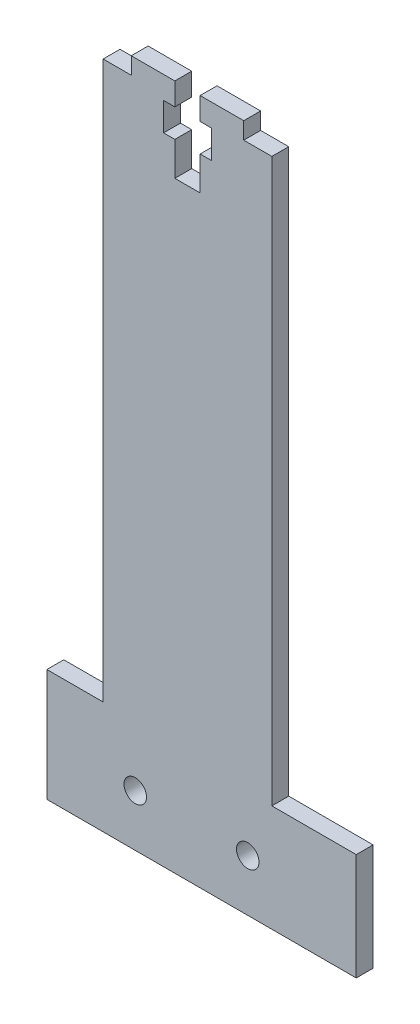
ISO-10303-21;
HEADER;
FILE_DESCRIPTION(('STEP AP214'),'2;1');
FILE_NAME('part.step','',(''),(''),'','','');
FILE_SCHEMA(('AUTOMOTIVE_DESIGN { 1 0 10303 214 1 1 1 1 }'));
ENDSEC;
DATA;
#1=APPLICATION_CONTEXT('core data for automotive mechanical design processes');
#2=APPLICATION_PROTOCOL_DEFINITION('international standard','automotive_design',2000,#1);
#3=PRODUCT_CONTEXT('',#1,'mechanical');
#4=PRODUCT('Part','Part','',(#3));
#5=PRODUCT_RELATED_PRODUCT_CATEGORY('part','',(#4));
#6=PRODUCT_DEFINITION_FORMATION('','',#4);
#7=PRODUCT_DEFINITION_CONTEXT('part definition',#1,'design');
#8=PRODUCT_DEFINITION('design','',#6,#7);
#9=PRODUCT_DEFINITION_SHAPE('','',#8);
#10=(LENGTH_UNIT() NAMED_UNIT(*) SI_UNIT(.MILLI.,.METRE.));
#11=(NAMED_UNIT(*) PLANE_ANGLE_UNIT() SI_UNIT($,.RADIAN.));
#12=(NAMED_UNIT(*) SI_UNIT($,.STERADIAN.) SOLID_ANGLE_UNIT());
#13=UNCERTAINTY_MEASURE_WITH_UNIT(LENGTH_MEASURE(1.E-05),#10,'distance_accuracy_value','');
#14=(GEOMETRIC_REPRESENTATION_CONTEXT(3) GLOBAL_UNCERTAINTY_ASSIGNED_CONTEXT((#13)) GLOBAL_UNIT_ASSIGNED_CONTEXT((#10,
#11,#12)) REPRESENTATION_CONTEXT('',''));
#15=CARTESIAN_POINT('',(0.,0.,0.));
#16=DIRECTION('',(0.,0.,1.));
#17=DIRECTION('',(1.,0.,0.));
#18=AXIS2_PLACEMENT_3D('',#15,#16,#17);
#19=CARTESIAN_POINT('',(-25.,0.,3.));
#20=DIRECTION('',(-1.,0.,0.));
#21=DIRECTION('',(0.,0.,1.));
#22=AXIS2_PLACEMENT_3D('',#19,#20,#21);
#23=PLANE('',#22);
#24=DIRECTION('',(0.,1.,0.));
#25=VECTOR('',#24,1.);
#26=CARTESIAN_POINT('',(-25.,0.,0.));
#27=LINE('',#26,#25);
#28=CARTESIAN_POINT('',(-25.,-59.5,0.));
#29=VERTEX_POINT('',#28);
#30=CARTESIAN_POINT('',(-25.,-39.5,0.));
#31=VERTEX_POINT('',#30);
#32=EDGE_CURVE('E255',#29,#31,#27,.T.);
#33=ORIENTED_EDGE('',*,*,#32,.F.);
#34=DIRECTION('',(0.,0.,-1.));
#35=VECTOR('',#34,1.);
#36=CARTESIAN_POINT('',(-25.,-59.5,3.));
#37=LINE('',#36,#35);
#38=CARTESIAN_POINT('',(-25.,-59.5,3.));
#39=VERTEX_POINT('',#38);
#40=EDGE_CURVE('E11',#39,#29,#37,.T.);
#41=ORIENTED_EDGE('',*,*,#40,.F.);
#42=DIRECTION('',(0.,1.,0.));
#43=VECTOR('',#42,1.);
#44=CARTESIAN_POINT('',(-25.,0.,3.));
#45=LINE('',#44,#43);
#46=CARTESIAN_POINT('',(-25.,-39.5,3.));
#47=VERTEX_POINT('',#46);
#48=EDGE_CURVE('E249',#39,#47,#45,.T.);
#49=ORIENTED_EDGE('',*,*,#48,.T.);
#50=DIRECTION('',(0.,0.,-1.));
#51=VECTOR('',#50,1.);
#52=CARTESIAN_POINT('',(-25.,-39.5,3.));
#53=LINE('',#52,#51);
#54=EDGE_CURVE('E139',#47,#31,#53,.T.);
#55=ORIENTED_EDGE('',*,*,#54,.T.);
#56=EDGE_LOOP('',(#33,#41,#49,#55));
#57=FACE_BOUND('',#56,.T.);
#58=ADVANCED_FACE('F41',(#57),#23,.T.);
#59=CARTESIAN_POINT('',(0.,-59.5,3.));
#60=DIRECTION('',(0.,-1.,0.));
#61=DIRECTION('',(0.,0.,-1.));
#62=AXIS2_PLACEMENT_3D('',#59,#60,#61);
#63=PLANE('',#62);
#64=DIRECTION('',(-1.,0.,0.));
#65=VECTOR('',#64,1.);
#66=CARTESIAN_POINT('',(0.,-59.5,0.));
#67=LINE('',#66,#65);
#68=CARTESIAN_POINT('',(30.,-59.5,0.));
#69=VERTEX_POINT('',#68);
#70=EDGE_CURVE('E290',#69,#29,#67,.T.);
#71=ORIENTED_EDGE('',*,*,#70,.F.);
#72=DIRECTION('',(0.,0.,-1.));
#73=VECTOR('',#72,1.);
#74=CARTESIAN_POINT('',(30.,-59.5,3.));
#75=LINE('',#74,#73);
#76=CARTESIAN_POINT('',(30.,-59.5,3.));
#77=VERTEX_POINT('',#76);
#78=EDGE_CURVE('E49',#77,#69,#75,.T.);
#79=ORIENTED_EDGE('',*,*,#78,.F.);
#80=DIRECTION('',(-1.,0.,0.));
#81=VECTOR('',#80,1.);
#82=CARTESIAN_POINT('',(0.,-59.5,3.));
#83=LINE('',#82,#81);
#84=EDGE_CURVE('E246',#77,#39,#83,.T.);
#85=ORIENTED_EDGE('',*,*,#84,.T.);
#86=ORIENTED_EDGE('',*,*,#40,.T.);
#87=EDGE_LOOP('',(#71,#79,#85,#86));
#88=FACE_BOUND('',#87,.T.);
#89=ADVANCED_FACE('F280',(#88),#63,.T.);
#90=CARTESIAN_POINT('',(30.,0.,3.));
#91=DIRECTION('',(-1.,0.,0.));
#92=DIRECTION('',(0.,0.,1.));
#93=AXIS2_PLACEMENT_3D('',#90,#91,#92);
#94=PLANE('',#93);
#95=DIRECTION('',(0.,1.,0.));
#96=VECTOR('',#95,1.);
#97=CARTESIAN_POINT('',(30.,0.,0.));
#98=LINE('',#97,#96);
#99=CARTESIAN_POINT('',(30.,-40.5,0.));
#100=VERTEX_POINT('',#99);
#101=EDGE_CURVE('E296',#69,#100,#98,.T.);
#102=ORIENTED_EDGE('',*,*,#101,.T.);
#103=DIRECTION('',(0.,0.,-1.));
#104=VECTOR('',#103,1.);
#105=CARTESIAN_POINT('',(30.,-40.5,3.));
#106=LINE('',#105,#104);
#107=CARTESIAN_POINT('',(30.,-40.5,3.));
#108=VERTEX_POINT('',#107);
#109=EDGE_CURVE('E393',#108,#100,#106,.T.);
#110=ORIENTED_EDGE('',*,*,#109,.F.);
#111=DIRECTION('',(0.,1.,0.));
#112=VECTOR('',#111,1.);
#113=CARTESIAN_POINT('',(30.,0.,3.));
#114=LINE('',#113,#112);
#115=EDGE_CURVE('E242',#77,#108,#114,.T.);
#116=ORIENTED_EDGE('',*,*,#115,.F.);
#117=ORIENTED_EDGE('',*,*,#78,.T.);
#118=EDGE_LOOP('',(#102,#110,#116,#117));
#119=FACE_BOUND('',#118,.T.);
#120=ADVANCED_FACE('F284',(#119),#94,.F.);
#121=CARTESIAN_POINT('',(0.,-40.5,3.));
#122=DIRECTION('',(0.,1.,0.));
#123=DIRECTION('',(-1.,0.,0.));
#124=AXIS2_PLACEMENT_3D('',#121,#122,#123);
#125=PLANE('',#124);
#126=DIRECTION('',(1.,0.,0.));
#127=VECTOR('',#126,1.);
#128=CARTESIAN_POINT('',(0.,-40.5,0.));
#129=LINE('',#128,#127);
#130=CARTESIAN_POINT('',(15.,-40.5,0.));
#131=VERTEX_POINT('',#130);
#132=EDGE_CURVE('E298',#131,#100,#129,.T.);
#133=ORIENTED_EDGE('',*,*,#132,.F.);
#134=DIRECTION('',(0.,0.,-1.));
#135=VECTOR('',#134,1.);
#136=CARTESIAN_POINT('',(15.,-40.5,3.));
#137=LINE('',#136,#135);
#138=CARTESIAN_POINT('',(15.,-40.5,3.));
#139=VERTEX_POINT('',#138);
#140=EDGE_CURVE('E391',#139,#131,#137,.T.);
#141=ORIENTED_EDGE('',*,*,#140,.F.);
#142=DIRECTION('',(1.,0.,0.));
#143=VECTOR('',#142,1.);
#144=CARTESIAN_POINT('',(0.,-40.5,3.));
#145=LINE('',#144,#143);
#146=EDGE_CURVE('E238',#139,#108,#145,.T.);
#147=ORIENTED_EDGE('',*,*,#146,.T.);
#148=ORIENTED_EDGE('',*,*,#109,.T.);
#149=EDGE_LOOP('',(#133,#141,#147,#148));
#150=FACE_BOUND('',#149,.T.);
#151=ADVANCED_FACE('F401',(#150),#125,.T.);
#152=CARTESIAN_POINT('',(15.,0.,3.));
#153=DIRECTION('',(1.,0.,0.));
#154=DIRECTION('',(0.,1.,0.));
#155=AXIS2_PLACEMENT_3D('',#152,#153,#154);
#156=PLANE('',#155);
#157=DIRECTION('',(0.,-1.,0.));
#158=VECTOR('',#157,1.);
#159=CARTESIAN_POINT('',(15.,0.,0.));
#160=LINE('',#159,#158);
#161=CARTESIAN_POINT('',(15.,59.5,0.));
#162=VERTEX_POINT('',#161);
#163=EDGE_CURVE('E303',#162,#131,#160,.T.);
#164=ORIENTED_EDGE('',*,*,#163,.F.);
#165=DIRECTION('',(0.,0.,-1.));
#166=VECTOR('',#165,1.);
#167=CARTESIAN_POINT('',(15.,59.5,3.));
#168=LINE('',#167,#166);
#169=CARTESIAN_POINT('',(15.,59.5,3.));
#170=VERTEX_POINT('',#169);
#171=EDGE_CURVE('E389',#170,#162,#168,.T.);
#172=ORIENTED_EDGE('',*,*,#171,.F.);
#173=DIRECTION('',(0.,-1.,0.));
#174=VECTOR('',#173,1.);
#175=CARTESIAN_POINT('',(15.,0.,3.));
#176=LINE('',#175,#174);
#177=EDGE_CURVE('E233',#170,#139,#176,.T.);
#178=ORIENTED_EDGE('',*,*,#177,.T.);
#179=ORIENTED_EDGE('',*,*,#140,.T.);
#180=EDGE_LOOP('',(#164,#172,#178,#179));
#181=FACE_BOUND('',#180,.T.);
#182=ADVANCED_FACE('F403',(#181),#156,.T.);
#183=CARTESIAN_POINT('',(0.,59.5,3.));
#184=DIRECTION('',(0.,1.,0.));
#185=DIRECTION('',(0.,0.,1.));
#186=AXIS2_PLACEMENT_3D('',#183,#184,#185);
#187=PLANE('',#186);
#188=DIRECTION('',(1.,0.,0.));
#189=VECTOR('',#188,1.);
#190=CARTESIAN_POINT('',(0.,59.5,0.));
#191=LINE('',#190,#189);
#192=CARTESIAN_POINT('',(9.99999999999999,59.5,0.));
#193=VERTEX_POINT('',#192);
#194=EDGE_CURVE('E306',#193,#162,#191,.T.);
#195=ORIENTED_EDGE('',*,*,#194,.F.);
#196=DIRECTION('',(0.,0.,-1.));
#197=VECTOR('',#196,1.);
#198=CARTESIAN_POINT('',(9.99999999999999,59.5,3.));
#199=LINE('',#198,#197);
#200=CARTESIAN_POINT('',(9.99999999999999,59.5,3.));
#201=VERTEX_POINT('',#200);
#202=EDGE_CURVE('E387',#201,#193,#199,.T.);
#203=ORIENTED_EDGE('',*,*,#202,.F.);
#204=DIRECTION('',(1.,0.,0.));
#205=VECTOR('',#204,1.);
#206=CARTESIAN_POINT('',(0.,59.5,3.));
#207=LINE('',#206,#205);
#208=EDGE_CURVE('E226',#201,#170,#207,.T.);
#209=ORIENTED_EDGE('',*,*,#208,.T.);
#210=ORIENTED_EDGE('',*,*,#171,.T.);
#211=EDGE_LOOP('',(#195,#203,#209,#210));
#212=FACE_BOUND('',#211,.T.);
#213=ADVANCED_FACE('F406',(#212),#187,.T.);
#214=CARTESIAN_POINT('',(9.99999999999999,0.,3.));
#215=DIRECTION('',(-1.,0.,0.));
#216=DIRECTION('',(0.,0.,1.));
#217=AXIS2_PLACEMENT_3D('',#214,#215,#216);
#218=PLANE('',#217);
#219=DIRECTION('',(0.,1.,0.));
#220=VECTOR('',#219,1.);
#221=CARTESIAN_POINT('',(9.99999999999999,0.,0.));
#222=LINE('',#221,#220);
#223=CARTESIAN_POINT('',(9.99999999999999,62.5,0.));
#224=VERTEX_POINT('',#223);
#225=EDGE_CURVE('E309',#193,#224,#222,.T.);
#226=ORIENTED_EDGE('',*,*,#225,.T.);
#227=DIRECTION('',(0.,0.,-1.));
#228=VECTOR('',#227,1.);
#229=CARTESIAN_POINT('',(9.99999999999999,62.5,3.));
#230=LINE('',#229,#228);
#231=CARTESIAN_POINT('',(9.99999999999999,62.5,3.));
#232=VERTEX_POINT('',#231);
#233=EDGE_CURVE('E385',#232,#224,#230,.T.);
#234=ORIENTED_EDGE('',*,*,#233,.F.);
#235=DIRECTION('',(0.,1.,0.));
#236=VECTOR('',#235,1.);
#237=CARTESIAN_POINT('',(9.99999999999999,0.,3.));
#238=LINE('',#237,#236);
#239=EDGE_CURVE('E232',#201,#232,#238,.T.);
#240=ORIENTED_EDGE('',*,*,#239,.F.);
#241=ORIENTED_EDGE('',*,*,#202,.T.);
#242=EDGE_LOOP('',(#226,#234,#240,#241));
#243=FACE_BOUND('',#242,.T.);
#244=ADVANCED_FACE('F410',(#243),#218,.F.);
#245=CARTESIAN_POINT('',(0.,62.5,3.));
#246=DIRECTION('',(0.,1.,0.));
#247=DIRECTION('',(0.,0.,1.));
#248=AXIS2_PLACEMENT_3D('',#245,#246,#247);
#249=PLANE('',#248);
#250=DIRECTION('',(1.,0.,0.));
#251=VECTOR('',#250,1.);
#252=CARTESIAN_POINT('',(0.,62.5,0.));
#253=LINE('',#252,#251);
#254=CARTESIAN_POINT('',(2.24999999999999,62.5,0.));
#255=VERTEX_POINT('',#254);
#256=EDGE_CURVE('E312',#255,#224,#253,.T.);
#257=ORIENTED_EDGE('',*,*,#256,.F.);
#258=DIRECTION('',(0.,0.,-1.));
#259=VECTOR('',#258,1.);
#260=CARTESIAN_POINT('',(2.24999999999999,62.5,3.));
#261=LINE('',#260,#259);
#262=CARTESIAN_POINT('',(2.24999999999999,62.5,3.));
#263=VERTEX_POINT('',#262);
#264=EDGE_CURVE('E383',#263,#255,#261,.T.);
#265=ORIENTED_EDGE('',*,*,#264,.F.);
#266=DIRECTION('',(1.,0.,0.));
#267=VECTOR('',#266,1.);
#268=CARTESIAN_POINT('',(0.,62.5,3.));
#269=LINE('',#268,#267);
#270=EDGE_CURVE('E236',#263,#232,#269,.T.);
#271=ORIENTED_EDGE('',*,*,#270,.T.);
#272=ORIENTED_EDGE('',*,*,#233,.T.);
#273=EDGE_LOOP('',(#257,#265,#271,#272));
#274=FACE_BOUND('',#273,.T.);
#275=ADVANCED_FACE('F526',(#274),#249,.T.);
#276=CARTESIAN_POINT('',(2.24999999999999,0.,3.));
#277=DIRECTION('',(-1.,0.,0.));
#278=DIRECTION('',(0.,0.,1.));
#279=AXIS2_PLACEMENT_3D('',#276,#277,#278);
#280=PLANE('',#279);
#281=DIRECTION('',(0.,1.,0.));
#282=VECTOR('',#281,1.);
#283=CARTESIAN_POINT('',(2.24999999999999,0.,0.));
#284=LINE('',#283,#282);
#285=CARTESIAN_POINT('',(2.24999999999999,58.5,0.));
#286=VERTEX_POINT('',#285);
#287=EDGE_CURVE('E315',#286,#255,#284,.T.);
#288=ORIENTED_EDGE('',*,*,#287,.F.);
#289=DIRECTION('',(0.,0.,-1.));
#290=VECTOR('',#289,1.);
#291=CARTESIAN_POINT('',(2.24999999999999,58.5,3.));
#292=LINE('',#291,#290);
#293=CARTESIAN_POINT('',(2.24999999999999,58.5,3.));
#294=VERTEX_POINT('',#293);
#295=EDGE_CURVE('E381',#294,#286,#292,.T.);
#296=ORIENTED_EDGE('',*,*,#295,.F.);
#297=DIRECTION('',(0.,1.,0.));
#298=VECTOR('',#297,1.);
#299=CARTESIAN_POINT('',(2.24999999999999,0.,3.));
#300=LINE('',#299,#298);
#301=EDGE_CURVE('E416',#294,#263,#300,.T.);
#302=ORIENTED_EDGE('',*,*,#301,.T.);
#303=ORIENTED_EDGE('',*,*,#264,.T.);
#304=EDGE_LOOP('',(#288,#296,#302,#303));
#305=FACE_BOUND('',#304,.T.);
#306=ADVANCED_FACE('F422',(#305),#280,.T.);
#307=CARTESIAN_POINT('',(0.,58.5,3.));
#308=DIRECTION('',(0.,-1.,0.));
#309=DIRECTION('',(0.,0.,-1.));
#310=AXIS2_PLACEMENT_3D('',#307,#308,#309);
#311=PLANE('',#310);
#312=DIRECTION('',(-1.,0.,0.));
#313=VECTOR('',#312,1.);
#314=CARTESIAN_POINT('',(0.,58.5,0.));
#315=LINE('',#314,#313);
#316=CARTESIAN_POINT('',(4.24999999999999,58.5,0.));
#317=VERTEX_POINT('',#316);
#318=EDGE_CURVE('E318',#317,#286,#315,.T.);
#319=ORIENTED_EDGE('',*,*,#318,.F.);
#320=DIRECTION('',(0.,0.,-1.));
#321=VECTOR('',#320,1.);
#322=CARTESIAN_POINT('',(4.24999999999999,58.5,3.));
#323=LINE('',#322,#321);
#324=CARTESIAN_POINT('',(4.24999999999999,58.5,3.));
#325=VERTEX_POINT('',#324);
#326=EDGE_CURVE('E379',#325,#317,#323,.T.);
#327=ORIENTED_EDGE('',*,*,#326,.F.);
#328=DIRECTION('',(-1.,0.,0.));
#329=VECTOR('',#328,1.);
#330=CARTESIAN_POINT('',(0.,58.5,3.));
#331=LINE('',#330,#329);
#332=EDGE_CURVE('E424',#325,#294,#331,.T.);
#333=ORIENTED_EDGE('',*,*,#332,.T.);
#334=ORIENTED_EDGE('',*,*,#295,.T.);
#335=EDGE_LOOP('',(#319,#327,#333,#334));
#336=FACE_BOUND('',#335,.T.);
#337=ADVANCED_FACE('F519',(#336),#311,.T.);
#338=CARTESIAN_POINT('',(4.24999999999999,0.,3.));
#339=DIRECTION('',(-1.,0.,0.));
#340=DIRECTION('',(0.,0.,1.));
#341=AXIS2_PLACEMENT_3D('',#338,#339,#340);
#342=PLANE('',#341);
#343=DIRECTION('',(0.,1.,0.));
#344=VECTOR('',#343,1.);
#345=CARTESIAN_POINT('',(4.24999999999999,0.,0.));
#346=LINE('',#345,#344);
#347=CARTESIAN_POINT('',(4.24999999999999,53.5,0.));
#348=VERTEX_POINT('',#347);
#349=EDGE_CURVE('E321',#348,#317,#346,.T.);
#350=ORIENTED_EDGE('',*,*,#349,.F.);
#351=DIRECTION('',(0.,0.,-1.));
#352=VECTOR('',#351,1.);
#353=CARTESIAN_POINT('',(4.24999999999999,53.5,3.));
#354=LINE('',#353,#352);
#355=CARTESIAN_POINT('',(4.24999999999999,53.5,3.));
#356=VERTEX_POINT('',#355);
#357=EDGE_CURVE('E377',#356,#348,#354,.T.);
#358=ORIENTED_EDGE('',*,*,#357,.F.);
#359=DIRECTION('',(0.,1.,0.));
#360=VECTOR('',#359,1.);
#361=CARTESIAN_POINT('',(4.24999999999999,0.,3.));
#362=LINE('',#361,#360);
#363=EDGE_CURVE('E426',#356,#325,#362,.T.);
#364=ORIENTED_EDGE('',*,*,#363,.T.);
#365=ORIENTED_EDGE('',*,*,#326,.T.);
#366=EDGE_LOOP('',(#350,#358,#364,#365));
#367=FACE_BOUND('',#366,.T.);
#368=ADVANCED_FACE('F515',(#367),#342,.T.);
#369=CARTESIAN_POINT('',(0.,53.5,3.));
#370=DIRECTION('',(0.,1.,0.));
#371=DIRECTION('',(0.,0.,1.));
#372=AXIS2_PLACEMENT_3D('',#369,#370,#371);
#373=PLANE('',#372);
#374=DIRECTION('',(1.,0.,0.));
#375=VECTOR('',#374,1.);
#376=CARTESIAN_POINT('',(0.,53.5,0.));
#377=LINE('',#376,#375);
#378=CARTESIAN_POINT('',(2.24999999999999,53.5,0.));
#379=VERTEX_POINT('',#378);
#380=EDGE_CURVE('E324',#379,#348,#377,.T.);
#381=ORIENTED_EDGE('',*,*,#380,.F.);
#382=DIRECTION('',(0.,0.,-1.));
#383=VECTOR('',#382,1.);
#384=CARTESIAN_POINT('',(2.24999999999999,53.5,3.));
#385=LINE('',#384,#383);
#386=CARTESIAN_POINT('',(2.24999999999999,53.5,3.));
#387=VERTEX_POINT('',#386);
#388=EDGE_CURVE('E375',#387,#379,#385,.T.);
#389=ORIENTED_EDGE('',*,*,#388,.F.);
#390=DIRECTION('',(1.,0.,0.));
#391=VECTOR('',#390,1.);
#392=CARTESIAN_POINT('',(0.,53.5,3.));
#393=LINE('',#392,#391);
#394=EDGE_CURVE('E431',#387,#356,#393,.T.);
#395=ORIENTED_EDGE('',*,*,#394,.T.);
#396=ORIENTED_EDGE('',*,*,#357,.T.);
#397=EDGE_LOOP('',(#381,#389,#395,#396));
#398=FACE_BOUND('',#397,.T.);
#399=ADVANCED_FACE('F511',(#398),#373,.T.);
#400=CARTESIAN_POINT('',(2.24999999999998,0.,3.));
#401=DIRECTION('',(-1.,0.,0.));
#402=DIRECTION('',(0.,-1.,0.));
#403=AXIS2_PLACEMENT_3D('',#400,#401,#402);
#404=PLANE('',#403);
#405=DIRECTION('',(0.,1.,0.));
#406=VECTOR('',#405,1.);
#407=CARTESIAN_POINT('',(2.24999999999998,0.,0.));
#408=LINE('',#407,#406);
#409=CARTESIAN_POINT('',(2.24999999999999,47.5,0.));
#410=VERTEX_POINT('',#409);
#411=EDGE_CURVE('E327',#410,#379,#408,.T.);
#412=ORIENTED_EDGE('',*,*,#411,.F.);
#413=DIRECTION('',(0.,0.,-1.));
#414=VECTOR('',#413,1.);
#415=CARTESIAN_POINT('',(2.24999999999999,47.5,3.));
#416=LINE('',#415,#414);
#417=CARTESIAN_POINT('',(2.24999999999999,47.5,3.));
#418=VERTEX_POINT('',#417);
#419=EDGE_CURVE('E373',#418,#410,#416,.T.);
#420=ORIENTED_EDGE('',*,*,#419,.F.);
#421=DIRECTION('',(0.,1.,0.));
#422=VECTOR('',#421,1.);
#423=CARTESIAN_POINT('',(2.24999999999998,0.,3.));
#424=LINE('',#423,#422);
#425=EDGE_CURVE('E434',#418,#387,#424,.T.);
#426=ORIENTED_EDGE('',*,*,#425,.T.);
#427=ORIENTED_EDGE('',*,*,#388,.T.);
#428=EDGE_LOOP('',(#412,#420,#426,#427));
#429=FACE_BOUND('',#428,.T.);
#430=ADVANCED_FACE('F507',(#429),#404,.T.);
#431=CARTESIAN_POINT('',(0.,47.5,3.));
#432=DIRECTION('',(0.,1.,0.));
#433=DIRECTION('',(0.,0.,1.));
#434=AXIS2_PLACEMENT_3D('',#431,#432,#433);
#435=PLANE('',#434);
#436=DIRECTION('',(1.,0.,0.));
#437=VECTOR('',#436,1.);
#438=CARTESIAN_POINT('',(0.,47.5,0.));
#439=LINE('',#438,#437);
#440=CARTESIAN_POINT('',(-2.25000000000001,47.5,0.));
#441=VERTEX_POINT('',#440);
#442=EDGE_CURVE('E330',#441,#410,#439,.T.);
#443=ORIENTED_EDGE('',*,*,#442,.F.);
#444=DIRECTION('',(0.,0.,-1.));
#445=VECTOR('',#444,1.);
#446=CARTESIAN_POINT('',(-2.25000000000001,47.5,3.));
#447=LINE('',#446,#445);
#448=CARTESIAN_POINT('',(-2.25000000000001,47.5,3.));
#449=VERTEX_POINT('',#448);
#450=EDGE_CURVE('E371',#449,#441,#447,.T.);
#451=ORIENTED_EDGE('',*,*,#450,.F.);
#452=DIRECTION('',(1.,0.,0.));
#453=VECTOR('',#452,1.);
#454=CARTESIAN_POINT('',(0.,47.5,3.));
#455=LINE('',#454,#453);
#456=EDGE_CURVE('E437',#449,#418,#455,.T.);
#457=ORIENTED_EDGE('',*,*,#456,.T.);
#458=ORIENTED_EDGE('',*,*,#419,.T.);
#459=EDGE_LOOP('',(#443,#451,#457,#458));
#460=FACE_BOUND('',#459,.T.);
#461=ADVANCED_FACE('F503',(#460),#435,.T.);
#462=CARTESIAN_POINT('',(-2.25,0.,3.));
#463=DIRECTION('',(1.,0.,0.));
#464=DIRECTION('',(0.,1.,0.));
#465=AXIS2_PLACEMENT_3D('',#462,#463,#464);
#466=PLANE('',#465);
#467=DIRECTION('',(0.,-1.,0.));
#468=VECTOR('',#467,1.);
#469=CARTESIAN_POINT('',(-2.25,0.,0.));
#470=LINE('',#469,#468);
#471=CARTESIAN_POINT('',(-2.25000000000001,53.5,0.));
#472=VERTEX_POINT('',#471);
#473=EDGE_CURVE('E333',#472,#441,#470,.T.);
#474=ORIENTED_EDGE('',*,*,#473,.F.);
#475=DIRECTION('',(0.,0.,-1.));
#476=VECTOR('',#475,1.);
#477=CARTESIAN_POINT('',(-2.25000000000001,53.5,3.));
#478=LINE('',#477,#476);
#479=CARTESIAN_POINT('',(-2.25000000000001,53.5,3.));
#480=VERTEX_POINT('',#479);
#481=EDGE_CURVE('E369',#480,#472,#478,.T.);
#482=ORIENTED_EDGE('',*,*,#481,.F.);
#483=DIRECTION('',(0.,-1.,0.));
#484=VECTOR('',#483,1.);
#485=CARTESIAN_POINT('',(-2.25,0.,3.));
#486=LINE('',#485,#484);
#487=EDGE_CURVE('E440',#480,#449,#486,.T.);
#488=ORIENTED_EDGE('',*,*,#487,.T.);
#489=ORIENTED_EDGE('',*,*,#450,.T.);
#490=EDGE_LOOP('',(#474,#482,#488,#489));
#491=FACE_BOUND('',#490,.T.);
#492=ADVANCED_FACE('F499',(#491),#466,.T.);
#493=CARTESIAN_POINT('',(0.,53.5,3.));
#494=DIRECTION('',(0.,1.,0.));
#495=DIRECTION('',(0.,0.,1.));
#496=AXIS2_PLACEMENT_3D('',#493,#494,#495);
#497=PLANE('',#496);
#498=DIRECTION('',(1.,0.,0.));
#499=VECTOR('',#498,1.);
#500=CARTESIAN_POINT('',(0.,53.5,0.));
#501=LINE('',#500,#499);
#502=CARTESIAN_POINT('',(-4.25000000000001,53.5,0.));
#503=VERTEX_POINT('',#502);
#504=EDGE_CURVE('E336',#503,#472,#501,.T.);
#505=ORIENTED_EDGE('',*,*,#504,.F.);
#506=DIRECTION('',(0.,0.,-1.));
#507=VECTOR('',#506,1.);
#508=CARTESIAN_POINT('',(-4.25000000000001,53.5,3.));
#509=LINE('',#508,#507);
#510=CARTESIAN_POINT('',(-4.25000000000001,53.5,3.));
#511=VERTEX_POINT('',#510);
#512=EDGE_CURVE('E367',#511,#503,#509,.T.);
#513=ORIENTED_EDGE('',*,*,#512,.F.);
#514=DIRECTION('',(1.,0.,0.));
#515=VECTOR('',#514,1.);
#516=CARTESIAN_POINT('',(0.,53.5,3.));
#517=LINE('',#516,#515);
#518=EDGE_CURVE('E443',#511,#480,#517,.T.);
#519=ORIENTED_EDGE('',*,*,#518,.T.);
#520=ORIENTED_EDGE('',*,*,#481,.T.);
#521=EDGE_LOOP('',(#505,#513,#519,#520));
#522=FACE_BOUND('',#521,.T.);
#523=ADVANCED_FACE('F495',(#522),#497,.T.);
#524=CARTESIAN_POINT('',(-4.25,0.,3.));
#525=DIRECTION('',(1.,0.,0.));
#526=DIRECTION('',(0.,1.,0.));
#527=AXIS2_PLACEMENT_3D('',#524,#525,#526);
#528=PLANE('',#527);
#529=DIRECTION('',(0.,-1.,0.));
#530=VECTOR('',#529,1.);
#531=CARTESIAN_POINT('',(-4.25,0.,0.));
#532=LINE('',#531,#530);
#533=CARTESIAN_POINT('',(-4.25000000000001,58.5,0.));
#534=VERTEX_POINT('',#533);
#535=EDGE_CURVE('E339',#534,#503,#532,.T.);
#536=ORIENTED_EDGE('',*,*,#535,.F.);
#537=DIRECTION('',(0.,0.,-1.));
#538=VECTOR('',#537,1.);
#539=CARTESIAN_POINT('',(-4.25000000000001,58.5,3.));
#540=LINE('',#539,#538);
#541=CARTESIAN_POINT('',(-4.25000000000001,58.5,3.));
#542=VERTEX_POINT('',#541);
#543=EDGE_CURVE('E365',#542,#534,#540,.T.);
#544=ORIENTED_EDGE('',*,*,#543,.F.);
#545=DIRECTION('',(0.,-1.,0.));
#546=VECTOR('',#545,1.);
#547=CARTESIAN_POINT('',(-4.25,0.,3.));
#548=LINE('',#547,#546);
#549=EDGE_CURVE('E446',#542,#511,#548,.T.);
#550=ORIENTED_EDGE('',*,*,#549,.T.);
#551=ORIENTED_EDGE('',*,*,#512,.T.);
#552=EDGE_LOOP('',(#536,#544,#550,#551));
#553=FACE_BOUND('',#552,.T.);
#554=ADVANCED_FACE('F491',(#553),#528,.T.);
#555=CARTESIAN_POINT('',(0.,58.5,3.));
#556=DIRECTION('',(0.,-1.,0.));
#557=DIRECTION('',(0.,0.,-1.));
#558=AXIS2_PLACEMENT_3D('',#555,#556,#557);
#559=PLANE('',#558);
#560=DIRECTION('',(-1.,0.,0.));
#561=VECTOR('',#560,1.);
#562=CARTESIAN_POINT('',(0.,58.5,0.));
#563=LINE('',#562,#561);
#564=CARTESIAN_POINT('',(-2.25000000000001,58.5,0.));
#565=VERTEX_POINT('',#564);
#566=EDGE_CURVE('E342',#565,#534,#563,.T.);
#567=ORIENTED_EDGE('',*,*,#566,.F.);
#568=DIRECTION('',(0.,0.,-1.));
#569=VECTOR('',#568,1.);
#570=CARTESIAN_POINT('',(-2.25000000000001,58.5,3.));
#571=LINE('',#570,#569);
#572=CARTESIAN_POINT('',(-2.25000000000001,58.5,3.));
#573=VERTEX_POINT('',#572);
#574=EDGE_CURVE('E363',#573,#565,#571,.T.);
#575=ORIENTED_EDGE('',*,*,#574,.F.);
#576=DIRECTION('',(-1.,0.,0.));
#577=VECTOR('',#576,1.);
#578=CARTESIAN_POINT('',(0.,58.5,3.));
#579=LINE('',#578,#577);
#580=EDGE_CURVE('E449',#573,#542,#579,.T.);
#581=ORIENTED_EDGE('',*,*,#580,.T.);
#582=ORIENTED_EDGE('',*,*,#543,.T.);
#583=EDGE_LOOP('',(#567,#575,#581,#582));
#584=FACE_BOUND('',#583,.T.);
#585=ADVANCED_FACE('F487',(#584),#559,.T.);
#586=CARTESIAN_POINT('',(-2.25,0.,3.));
#587=DIRECTION('',(1.,0.,0.));
#588=DIRECTION('',(0.,1.,0.));
#589=AXIS2_PLACEMENT_3D('',#586,#587,#588);
#590=PLANE('',#589);
#591=DIRECTION('',(0.,-1.,0.));
#592=VECTOR('',#591,1.);
#593=CARTESIAN_POINT('',(-2.25,0.,0.));
#594=LINE('',#593,#592);
#595=CARTESIAN_POINT('',(-2.25000000000001,62.5,0.));
#596=VERTEX_POINT('',#595);
#597=EDGE_CURVE('E345',#596,#565,#594,.T.);
#598=ORIENTED_EDGE('',*,*,#597,.F.);
#599=DIRECTION('',(0.,0.,-1.));
#600=VECTOR('',#599,1.);
#601=CARTESIAN_POINT('',(-2.25000000000001,62.5,3.));
#602=LINE('',#601,#600);
#603=CARTESIAN_POINT('',(-2.25000000000001,62.5,3.));
#604=VERTEX_POINT('',#603);
#605=EDGE_CURVE('E361',#604,#596,#602,.T.);
#606=ORIENTED_EDGE('',*,*,#605,.F.);
#607=DIRECTION('',(0.,-1.,0.));
#608=VECTOR('',#607,1.);
#609=CARTESIAN_POINT('',(-2.25,0.,3.));
#610=LINE('',#609,#608);
#611=EDGE_CURVE('E452',#604,#573,#610,.T.);
#612=ORIENTED_EDGE('',*,*,#611,.T.);
#613=ORIENTED_EDGE('',*,*,#574,.T.);
#614=EDGE_LOOP('',(#598,#606,#612,#613));
#615=FACE_BOUND('',#614,.T.);
#616=ADVANCED_FACE('F484',(#615),#590,.T.);
#617=CARTESIAN_POINT('',(0.,62.5,3.));
#618=DIRECTION('',(0.,1.,0.));
#619=DIRECTION('',(0.,0.,1.));
#620=AXIS2_PLACEMENT_3D('',#617,#618,#619);
#621=PLANE('',#620);
#622=DIRECTION('',(1.,0.,0.));
#623=VECTOR('',#622,1.);
#624=CARTESIAN_POINT('',(0.,62.5,0.));
#625=LINE('',#624,#623);
#626=CARTESIAN_POINT('',(-10.,62.5,0.));
#627=VERTEX_POINT('',#626);
#628=EDGE_CURVE('E348',#627,#596,#625,.T.);
#629=ORIENTED_EDGE('',*,*,#628,.F.);
#630=DIRECTION('',(0.,0.,-1.));
#631=VECTOR('',#630,1.);
#632=CARTESIAN_POINT('',(-10.,62.5,3.));
#633=LINE('',#632,#631);
#634=CARTESIAN_POINT('',(-10.,62.5,3.));
#635=VERTEX_POINT('',#634);
#636=EDGE_CURVE('E359',#635,#627,#633,.T.);
#637=ORIENTED_EDGE('',*,*,#636,.F.);
#638=DIRECTION('',(1.,0.,0.));
#639=VECTOR('',#638,1.);
#640=CARTESIAN_POINT('',(0.,62.5,3.));
#641=LINE('',#640,#639);
#642=EDGE_CURVE('E227',#635,#604,#641,.T.);
#643=ORIENTED_EDGE('',*,*,#642,.T.);
#644=ORIENTED_EDGE('',*,*,#605,.T.);
#645=EDGE_LOOP('',(#629,#637,#643,#644));
#646=FACE_BOUND('',#645,.T.);
#647=ADVANCED_FACE('F458',(#646),#621,.T.);
#648=CARTESIAN_POINT('',(-10.,0.,3.));
#649=DIRECTION('',(-1.,0.,0.));
#650=DIRECTION('',(0.,0.,1.));
#651=AXIS2_PLACEMENT_3D('',#648,#649,#650);
#652=PLANE('',#651);
#653=DIRECTION('',(0.,1.,0.));
#654=VECTOR('',#653,1.);
#655=CARTESIAN_POINT('',(-10.,0.,0.));
#656=LINE('',#655,#654);
#657=CARTESIAN_POINT('',(-10.,59.5,0.));
#658=VERTEX_POINT('',#657);
#659=EDGE_CURVE('E351',#658,#627,#656,.T.);
#660=ORIENTED_EDGE('',*,*,#659,.F.);
#661=DIRECTION('',(0.,0.,-1.));
#662=VECTOR('',#661,1.);
#663=CARTESIAN_POINT('',(-10.,59.5,3.));
#664=LINE('',#663,#662);
#665=CARTESIAN_POINT('',(-10.,59.5,3.));
#666=VERTEX_POINT('',#665);
#667=EDGE_CURVE('E214',#666,#658,#664,.T.);
#668=ORIENTED_EDGE('',*,*,#667,.F.);
#669=DIRECTION('',(0.,1.,0.));
#670=VECTOR('',#669,1.);
#671=CARTESIAN_POINT('',(-10.,0.,3.));
#672=LINE('',#671,#670);
#673=EDGE_CURVE('E224',#666,#635,#672,.T.);
#674=ORIENTED_EDGE('',*,*,#673,.T.);
#675=ORIENTED_EDGE('',*,*,#636,.T.);
#676=EDGE_LOOP('',(#660,#668,#674,#675));
#677=FACE_BOUND('',#676,.T.);
#678=ADVANCED_FACE('F464',(#677),#652,.T.);
#679=CARTESIAN_POINT('',(-15.,59.5,0.));
#680=VERTEX_POINT('',#679);
#681=EDGE_CURVE('E213',#680,#658,#191,.T.);
#682=ORIENTED_EDGE('',*,*,#681,.F.);
#683=DIRECTION('',(0.,0.,-1.));
#684=VECTOR('',#683,1.);
#685=CARTESIAN_POINT('',(-15.,59.5,3.));
#686=LINE('',#685,#684);
#687=CARTESIAN_POINT('',(-15.,59.5,3.));
#688=VERTEX_POINT('',#687);
#689=EDGE_CURVE('E207',#688,#680,#686,.T.);
#690=ORIENTED_EDGE('',*,*,#689,.F.);
#691=EDGE_CURVE('E211',#688,#666,#207,.T.);
#692=ORIENTED_EDGE('',*,*,#691,.T.);
#693=ORIENTED_EDGE('',*,*,#667,.T.);
#694=EDGE_LOOP('',(#682,#690,#692,#693));
#695=FACE_BOUND('',#694,.T.);
#696=ADVANCED_FACE('F209',(#695),#187,.T.);
#697=CARTESIAN_POINT('',(-15.,0.,3.));
#698=DIRECTION('',(1.,0.,0.));
#699=DIRECTION('',(0.,1.,0.));
#700=AXIS2_PLACEMENT_3D('',#697,#698,#699);
#701=PLANE('',#700);
#702=DIRECTION('',(0.,-1.,0.));
#703=VECTOR('',#702,1.);
#704=CARTESIAN_POINT('',(-15.,0.,0.));
#705=LINE('',#704,#703);
#706=CARTESIAN_POINT('',(-15.,-39.5,0.));
#707=VERTEX_POINT('',#706);
#708=EDGE_CURVE('E132',#680,#707,#705,.T.);
#709=ORIENTED_EDGE('',*,*,#708,.T.);
#710=DIRECTION('',(0.,0.,-1.));
#711=VECTOR('',#710,1.);
#712=CARTESIAN_POINT('',(-15.,-39.5,3.));
#713=LINE('',#712,#711);
#714=CARTESIAN_POINT('',(-15.,-39.5,3.));
#715=VERTEX_POINT('',#714);
#716=EDGE_CURVE('E215',#715,#707,#713,.T.);
#717=ORIENTED_EDGE('',*,*,#716,.F.);
#718=DIRECTION('',(0.,-1.,0.));
#719=VECTOR('',#718,1.);
#720=CARTESIAN_POINT('',(-15.,0.,3.));
#721=LINE('',#720,#719);
#722=EDGE_CURVE('E217',#688,#715,#721,.T.);
#723=ORIENTED_EDGE('',*,*,#722,.F.);
#724=ORIENTED_EDGE('',*,*,#689,.T.);
#725=EDGE_LOOP('',(#709,#717,#723,#724));
#726=FACE_BOUND('',#725,.T.);
#727=ADVANCED_FACE('F218',(#726),#701,.F.);
#728=CARTESIAN_POINT('',(0.,-39.5,3.));
#729=DIRECTION('',(0.,-1.,0.));
#730=DIRECTION('',(0.,0.,-1.));
#731=AXIS2_PLACEMENT_3D('',#728,#729,#730);
#732=PLANE('',#731);
#733=DIRECTION('',(-1.,0.,0.));
#734=VECTOR('',#733,1.);
#735=CARTESIAN_POINT('',(0.,-39.5,0.));
#736=LINE('',#735,#734);
#737=EDGE_CURVE('E251',#707,#31,#736,.T.);
#738=ORIENTED_EDGE('',*,*,#737,.T.);
#739=ORIENTED_EDGE('',*,*,#54,.F.);
#740=DIRECTION('',(-1.,0.,0.));
#741=VECTOR('',#740,1.);
#742=CARTESIAN_POINT('',(0.,-39.5,3.));
#743=LINE('',#742,#741);
#744=EDGE_CURVE('E57',#715,#47,#743,.T.);
#745=ORIENTED_EDGE('',*,*,#744,.F.);
#746=ORIENTED_EDGE('',*,*,#716,.T.);
#747=EDGE_LOOP('',(#738,#739,#745,#746));
#748=FACE_BOUND('',#747,.T.);
#749=ADVANCED_FACE('F466',(#748),#732,.F.);
#750=CARTESIAN_POINT('',(0.,0.,3.));
#751=DIRECTION('',(0.,0.,1.));
#752=DIRECTION('',(1.,0.,0.));
#753=AXIS2_PLACEMENT_3D('',#750,#751,#752);
#754=PLANE('',#753);
#755=CARTESIAN_POINT('',(10.711162973999,-50.2959368853814,3.));
#756=DIRECTION('',(0.,0.,1.));
#757=DIRECTION('',(1.,0.,0.));
#758=AXIS2_PLACEMENT_3D('',#755,#756,#757);
#759=CIRCLE('',#758,2.);
#760=CARTESIAN_POINT('',(12.711162973999,-50.2959368853814,3.));
#761=VERTEX_POINT('',#760);
#762=EDGE_CURVE('E252',#761,#761,#759,.T.);
#763=ORIENTED_EDGE('',*,*,#762,.F.);
#764=EDGE_LOOP('',(#763));
#765=FACE_BOUND('',#764,.T.);
#766=CARTESIAN_POINT('',(-9.28883702600096,-50.2959368853814,3.));
#767=DIRECTION('',(0.,0.,1.));
#768=DIRECTION('',(1.,0.,0.));
#769=AXIS2_PLACEMENT_3D('',#766,#767,#768);
#770=CIRCLE('',#769,2.);
#771=CARTESIAN_POINT('',(-7.28883702600095,-50.2959368853814,3.));
#772=VERTEX_POINT('',#771);
#773=EDGE_CURVE('E256',#772,#772,#770,.T.);
#774=ORIENTED_EDGE('',*,*,#773,.F.);
#775=EDGE_LOOP('',(#774));
#776=FACE_BOUND('',#775,.T.);
#777=ORIENTED_EDGE('',*,*,#48,.F.);
#778=ORIENTED_EDGE('',*,*,#84,.F.);
#779=ORIENTED_EDGE('',*,*,#115,.T.);
#780=ORIENTED_EDGE('',*,*,#146,.F.);
#781=ORIENTED_EDGE('',*,*,#177,.F.);
#782=ORIENTED_EDGE('',*,*,#208,.F.);
#783=ORIENTED_EDGE('',*,*,#239,.T.);
#784=ORIENTED_EDGE('',*,*,#270,.F.);
#785=ORIENTED_EDGE('',*,*,#301,.F.);
#786=ORIENTED_EDGE('',*,*,#332,.F.);
#787=ORIENTED_EDGE('',*,*,#363,.F.);
#788=ORIENTED_EDGE('',*,*,#394,.F.);
#789=ORIENTED_EDGE('',*,*,#425,.F.);
#790=ORIENTED_EDGE('',*,*,#456,.F.);
#791=ORIENTED_EDGE('',*,*,#487,.F.);
#792=ORIENTED_EDGE('',*,*,#518,.F.);
#793=ORIENTED_EDGE('',*,*,#549,.F.);
#794=ORIENTED_EDGE('',*,*,#580,.F.);
#795=ORIENTED_EDGE('',*,*,#611,.F.);
#796=ORIENTED_EDGE('',*,*,#642,.F.);
#797=ORIENTED_EDGE('',*,*,#673,.F.);
#798=ORIENTED_EDGE('',*,*,#691,.F.);
#799=ORIENTED_EDGE('',*,*,#722,.T.);
#800=ORIENTED_EDGE('',*,*,#744,.T.);
#801=EDGE_LOOP('',(#777,#778,#779,#780,#781,#782,#783,#784,#785,#786,#787,#788,#789,#790,#791,
#792,#793,#794,#795,#796,#797,#798,#799,#800));
#802=FACE_BOUND('',#801,.T.);
#803=ADVANCED_FACE('F221',(#765,#776,#802),#754,.T.);
#804=CARTESIAN_POINT('',(0.,0.,0.));
#805=DIRECTION('',(0.,0.,1.));
#806=DIRECTION('',(1.,0.,0.));
#807=AXIS2_PLACEMENT_3D('',#804,#805,#806);
#808=PLANE('',#807);
#809=CARTESIAN_POINT('',(10.711162973999,-50.2959368853814,0.));
#810=DIRECTION('',(0.,0.,1.));
#811=DIRECTION('',(1.,0.,0.));
#812=AXIS2_PLACEMENT_3D('',#809,#810,#811);
#813=CIRCLE('',#812,2.);
#814=CARTESIAN_POINT('',(12.711162973999,-50.2959368853814,0.));
#815=VERTEX_POINT('',#814);
#816=EDGE_CURVE('E259',#815,#815,#813,.T.);
#817=ORIENTED_EDGE('',*,*,#816,.T.);
#818=EDGE_LOOP('',(#817));
#819=FACE_BOUND('',#818,.T.);
#820=CARTESIAN_POINT('',(-9.28883702600096,-50.2959368853814,0.));
#821=DIRECTION('',(0.,0.,1.));
#822=DIRECTION('',(1.,0.,0.));
#823=AXIS2_PLACEMENT_3D('',#820,#821,#822);
#824=CIRCLE('',#823,2.);
#825=CARTESIAN_POINT('',(-7.28883702600095,-50.2959368853814,0.));
#826=VERTEX_POINT('',#825);
#827=EDGE_CURVE('E260',#826,#826,#824,.T.);
#828=ORIENTED_EDGE('',*,*,#827,.T.);
#829=EDGE_LOOP('',(#828));
#830=FACE_BOUND('',#829,.T.);
#831=ORIENTED_EDGE('',*,*,#32,.T.);
#832=ORIENTED_EDGE('',*,*,#737,.F.);
#833=ORIENTED_EDGE('',*,*,#708,.F.);
#834=ORIENTED_EDGE('',*,*,#681,.T.);
#835=ORIENTED_EDGE('',*,*,#659,.T.);
#836=ORIENTED_EDGE('',*,*,#628,.T.);
#837=ORIENTED_EDGE('',*,*,#597,.T.);
#838=ORIENTED_EDGE('',*,*,#566,.T.);
#839=ORIENTED_EDGE('',*,*,#535,.T.);
#840=ORIENTED_EDGE('',*,*,#504,.T.);
#841=ORIENTED_EDGE('',*,*,#473,.T.);
#842=ORIENTED_EDGE('',*,*,#442,.T.);
#843=ORIENTED_EDGE('',*,*,#411,.T.);
#844=ORIENTED_EDGE('',*,*,#380,.T.);
#845=ORIENTED_EDGE('',*,*,#349,.T.);
#846=ORIENTED_EDGE('',*,*,#318,.T.);
#847=ORIENTED_EDGE('',*,*,#287,.T.);
#848=ORIENTED_EDGE('',*,*,#256,.T.);
#849=ORIENTED_EDGE('',*,*,#225,.F.);
#850=ORIENTED_EDGE('',*,*,#194,.T.);
#851=ORIENTED_EDGE('',*,*,#163,.T.);
#852=ORIENTED_EDGE('',*,*,#132,.T.);
#853=ORIENTED_EDGE('',*,*,#101,.F.);
#854=ORIENTED_EDGE('',*,*,#70,.T.);
#855=EDGE_LOOP('',(#831,#832,#833,#834,#835,#836,#837,#838,#839,#840,#841,#842,#843,#844,#845,
#846,#847,#848,#849,#850,#851,#852,#853,#854));
#856=FACE_BOUND('',#855,.T.);
#857=ADVANCED_FACE('F266',(#819,#830,#856),#808,.F.);
#858=CARTESIAN_POINT('',(-9.28883702600096,-50.2959368853814,0.));
#859=DIRECTION('',(0.,0.,1.));
#860=DIRECTION('',(1.,0.,0.));
#861=AXIS2_PLACEMENT_3D('',#858,#859,#860);
#862=CYLINDRICAL_SURFACE('',#861,2.);
#863=ORIENTED_EDGE('',*,*,#773,.T.);
#864=EDGE_LOOP('',(#863));
#865=FACE_BOUND('',#864,.T.);
#866=ORIENTED_EDGE('',*,*,#827,.F.);
#867=EDGE_LOOP('',(#866));
#868=FACE_BOUND('',#867,.T.);
#869=ADVANCED_FACE('F271',(#865,#868),#862,.F.);
#870=CARTESIAN_POINT('',(10.711162973999,-50.2959368853814,0.));
#871=DIRECTION('',(0.,0.,1.));
#872=DIRECTION('',(1.,0.,0.));
#873=AXIS2_PLACEMENT_3D('',#870,#871,#872);
#874=CYLINDRICAL_SURFACE('',#873,2.);
#875=ORIENTED_EDGE('',*,*,#762,.T.);
#876=EDGE_LOOP('',(#875));
#877=FACE_BOUND('',#876,.T.);
#878=ORIENTED_EDGE('',*,*,#816,.F.);
#879=EDGE_LOOP('',(#878));
#880=FACE_BOUND('',#879,.T.);
#881=ADVANCED_FACE('F269',(#877,#880),#874,.F.);
#882=CLOSED_SHELL('',(#58,#89,#120,#151,#182,#213,#244,#275,#306,#337,#368,#399,#430,#461,#492,
#523,#554,#585,#616,#647,#678,#696,#727,#749,#803,#857,#869,#881));
#883=MANIFOLD_SOLID_BREP('B2',#882);
#884=ADVANCED_BREP_SHAPE_REPRESENTATION('',(#18,#883),#14);
#885=SHAPE_DEFINITION_REPRESENTATION(#9,#884);
ENDSEC;
END-ISO-10303-21;
